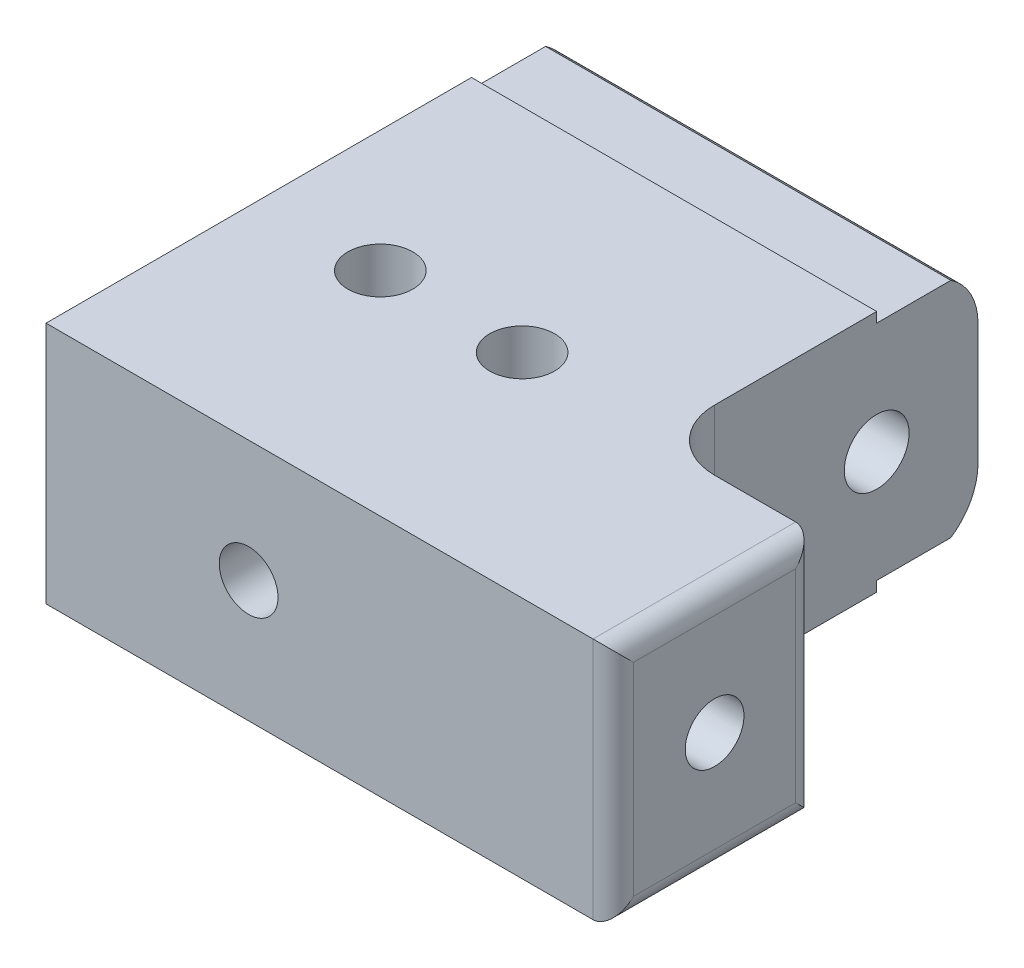
ISO-10303-21;
HEADER;
FILE_DESCRIPTION(('STEP AP214'),'2;1');
FILE_NAME('part.step','',(''),(''),'','','');
FILE_SCHEMA(('AUTOMOTIVE_DESIGN { 1 0 10303 214 1 1 1 1 }'));
ENDSEC;
DATA;
#1=APPLICATION_CONTEXT('core data for automotive mechanical design processes');
#2=APPLICATION_PROTOCOL_DEFINITION('international standard','automotive_design',2000,#1);
#3=PRODUCT_CONTEXT('',#1,'mechanical');
#4=PRODUCT('Part','Part','',(#3));
#5=PRODUCT_RELATED_PRODUCT_CATEGORY('part','',(#4));
#6=PRODUCT_DEFINITION_FORMATION('','',#4);
#7=PRODUCT_DEFINITION_CONTEXT('part definition',#1,'design');
#8=PRODUCT_DEFINITION('design','',#6,#7);
#9=PRODUCT_DEFINITION_SHAPE('','',#8);
#10=(LENGTH_UNIT() NAMED_UNIT(*) SI_UNIT(.MILLI.,.METRE.));
#11=(NAMED_UNIT(*) PLANE_ANGLE_UNIT() SI_UNIT($,.RADIAN.));
#12=(NAMED_UNIT(*) SI_UNIT($,.STERADIAN.) SOLID_ANGLE_UNIT());
#13=UNCERTAINTY_MEASURE_WITH_UNIT(LENGTH_MEASURE(1.E-05),#10,'distance_accuracy_value','');
#14=(GEOMETRIC_REPRESENTATION_CONTEXT(3) GLOBAL_UNCERTAINTY_ASSIGNED_CONTEXT((#13)) GLOBAL_UNIT_ASSIGNED_CONTEXT((#10,
#11,#12)) REPRESENTATION_CONTEXT('',''));
#15=CARTESIAN_POINT('',(0.,0.,0.));
#16=DIRECTION('',(0.,0.,1.));
#17=DIRECTION('',(1.,0.,0.));
#18=AXIS2_PLACEMENT_3D('',#15,#16,#17);
#19=CARTESIAN_POINT('',(28.,-6.,21.));
#20=DIRECTION('',(-1.,0.,0.));
#21=DIRECTION('',(0.,-1.,0.));
#22=AXIS2_PLACEMENT_3D('',#19,#20,#21);
#23=CYLINDRICAL_SURFACE('',#22,1.45);
#24=CARTESIAN_POINT('',(0.,-6.,21.));
#25=DIRECTION('',(-1.,0.,0.));
#26=DIRECTION('',(0.,-1.,0.));
#27=AXIS2_PLACEMENT_3D('',#24,#25,#26);
#28=CIRCLE('',#27,1.45);
#29=CARTESIAN_POINT('',(0.,-7.45,21.));
#30=VERTEX_POINT('',#29);
#31=EDGE_CURVE('E287',#30,#30,#28,.T.);
#32=ORIENTED_EDGE('',*,*,#31,.T.);
#33=EDGE_LOOP('',(#32));
#34=FACE_BOUND('',#33,.T.);
#35=CARTESIAN_POINT('',(10.,-6.,21.));
#36=DIRECTION('',(-0.707106781186547,0.,-0.707106781186547));
#37=DIRECTION('',(-0.707106781186547,0.,0.707106781186547));
#38=AXIS2_PLACEMENT_3D('',#35,#36,#37);
#39=ELLIPSE('',#38,2.05060966544099,1.45);
#40=CARTESIAN_POINT('',(10.,-4.55,21.));
#41=VERTEX_POINT('',#40);
#42=CARTESIAN_POINT('',(10.,-7.45,21.));
#43=VERTEX_POINT('',#42);
#44=EDGE_CURVE('E46',#41,#43,#39,.F.);
#45=ORIENTED_EDGE('',*,*,#44,.T.);
#46=CARTESIAN_POINT('',(10.,-6.,21.));
#47=DIRECTION('',(-0.707106781186547,0.,0.707106781186547));
#48=DIRECTION('',(-0.707106781186547,0.,-0.707106781186547));
#49=AXIS2_PLACEMENT_3D('',#46,#47,#48);
#50=ELLIPSE('',#49,2.05060966544099,1.45);
#51=EDGE_CURVE('E11',#43,#41,#50,.F.);
#52=ORIENTED_EDGE('',*,*,#51,.T.);
#53=EDGE_LOOP('',(#45,#52));
#54=FACE_BOUND('',#53,.T.);
#55=ADVANCED_FACE('F33',(#34,#54),#23,.F.);
#56=CARTESIAN_POINT('',(0.,0.,0.));
#57=DIRECTION('',(0.,0.,1.));
#58=DIRECTION('',(1.,0.,0.));
#59=AXIS2_PLACEMENT_3D('',#56,#57,#58);
#60=PLANE('',#59);
#61=DIRECTION('',(1.,0.,0.));
#62=VECTOR('',#61,1.);
#63=CARTESIAN_POINT('',(0.,-9.,0.));
#64=LINE('',#63,#62);
#65=CARTESIAN_POINT('',(20.,-9.,0.));
#66=VERTEX_POINT('',#65);
#67=CARTESIAN_POINT('',(12.75,-8.99999999999999,0.));
#68=VERTEX_POINT('',#67);
#69=EDGE_CURVE('E197',#66,#68,#64,.F.);
#70=ORIENTED_EDGE('',*,*,#69,.T.);
#71=DIRECTION('',(0.,-1.,0.));
#72=VECTOR('',#71,1.);
#73=CARTESIAN_POINT('',(12.75,7.37579522466093,0.));
#74=LINE('',#73,#72);
#75=CARTESIAN_POINT('',(12.75,-3.,0.));
#76=VERTEX_POINT('',#75);
#77=EDGE_CURVE('E343',#76,#68,#74,.T.);
#78=ORIENTED_EDGE('',*,*,#77,.F.);
#79=DIRECTION('',(-1.,0.,0.));
#80=VECTOR('',#79,1.);
#81=CARTESIAN_POINT('',(0.,-3.,0.));
#82=LINE('',#81,#80);
#83=CARTESIAN_POINT('',(20.,-3.,0.));
#84=VERTEX_POINT('',#83);
#85=EDGE_CURVE('E204',#76,#84,#82,.F.);
#86=ORIENTED_EDGE('',*,*,#85,.T.);
#87=DIRECTION('',(0.,1.,0.));
#88=VECTOR('',#87,1.);
#89=CARTESIAN_POINT('',(20.,0.,0.));
#90=LINE('',#89,#88);
#91=EDGE_CURVE('E263',#66,#84,#90,.T.);
#92=ORIENTED_EDGE('',*,*,#91,.F.);
#93=EDGE_LOOP('',(#70,#78,#86,#92));
#94=FACE_BOUND('',#93,.T.);
#95=ADVANCED_FACE('F368',(#94),#60,.F.);
#96=CARTESIAN_POINT('',(20.,0.,26.));
#97=DIRECTION('',(-1.,0.,0.));
#98=DIRECTION('',(0.,0.,1.));
#99=AXIS2_PLACEMENT_3D('',#96,#97,#98);
#100=PLANE('',#99);
#101=CARTESIAN_POINT('',(20.,-6.,5.));
#102=DIRECTION('',(-1.,0.,0.));
#103=DIRECTION('',(0.,0.,1.));
#104=AXIS2_PLACEMENT_3D('',#101,#102,#103);
#105=CIRCLE('',#104,1.6);
#106=CARTESIAN_POINT('',(20.,-6.,6.6));
#107=VERTEX_POINT('',#106);
#108=EDGE_CURVE('E280',#107,#107,#105,.T.);
#109=ORIENTED_EDGE('',*,*,#108,.T.);
#110=EDGE_LOOP('',(#109));
#111=FACE_BOUND('',#110,.T.);
#112=DIRECTION('',(0.,0.,1.));
#113=VECTOR('',#112,1.);
#114=CARTESIAN_POINT('',(20.,-0.499999999999995,26.));
#115=LINE('',#114,#113);
#116=CARTESIAN_POINT('',(20.,-0.500000000000001,1.3416876048223));
#117=VERTEX_POINT('',#116);
#118=CARTESIAN_POINT('',(20.,-0.499999999999998,5.));
#119=VERTEX_POINT('',#118);
#120=EDGE_CURVE('E320',#117,#119,#115,.T.);
#121=ORIENTED_EDGE('',*,*,#120,.T.);
#122=DIRECTION('',(0.,1.,0.));
#123=VECTOR('',#122,1.);
#124=CARTESIAN_POINT('',(20.,0.,5.));
#125=LINE('',#124,#123);
#126=CARTESIAN_POINT('',(20.,0.,5.));
#127=VERTEX_POINT('',#126);
#128=EDGE_CURVE('E317',#119,#127,#125,.T.);
#129=ORIENTED_EDGE('',*,*,#128,.T.);
#130=DIRECTION('',(0.,0.,-1.));
#131=VECTOR('',#130,1.);
#132=CARTESIAN_POINT('',(20.,0.,26.));
#133=LINE('',#132,#131);
#134=CARTESIAN_POINT('',(20.,0.,13.));
#135=VERTEX_POINT('',#134);
#136=EDGE_CURVE('E256',#135,#127,#133,.T.);
#137=ORIENTED_EDGE('',*,*,#136,.F.);
#138=DIRECTION('',(0.,1.,0.));
#139=VECTOR('',#138,1.);
#140=CARTESIAN_POINT('',(20.,-12.,13.));
#141=LINE('',#140,#139);
#142=CARTESIAN_POINT('',(20.,-12.,13.));
#143=VERTEX_POINT('',#142);
#144=EDGE_CURVE('E245',#135,#143,#141,.F.);
#145=ORIENTED_EDGE('',*,*,#144,.T.);
#146=DIRECTION('',(0.,0.,-1.));
#147=VECTOR('',#146,1.);
#148=CARTESIAN_POINT('',(20.,-12.,26.));
#149=LINE('',#148,#147);
#150=CARTESIAN_POINT('',(20.,-12.,5.));
#151=VERTEX_POINT('',#150);
#152=EDGE_CURVE('E253',#143,#151,#149,.T.);
#153=ORIENTED_EDGE('',*,*,#152,.T.);
#154=DIRECTION('',(0.,1.,0.));
#155=VECTOR('',#154,1.);
#156=CARTESIAN_POINT('',(20.,0.,4.99999999999998));
#157=LINE('',#156,#155);
#158=CARTESIAN_POINT('',(20.,-11.5,5.));
#159=VERTEX_POINT('',#158);
#160=EDGE_CURVE('E222',#151,#159,#157,.T.);
#161=ORIENTED_EDGE('',*,*,#160,.T.);
#162=DIRECTION('',(0.,0.,-1.));
#163=VECTOR('',#162,1.);
#164=CARTESIAN_POINT('',(20.,-11.5,26.));
#165=LINE('',#164,#163);
#166=CARTESIAN_POINT('',(20.,-11.5,1.3416876048223));
#167=VERTEX_POINT('',#166);
#168=EDGE_CURVE('E305',#159,#167,#165,.T.);
#169=ORIENTED_EDGE('',*,*,#168,.T.);
#170=CARTESIAN_POINT('',(20.,-9.,3.));
#171=DIRECTION('',(-1.,0.,0.));
#172=DIRECTION('',(0.,0.,1.));
#173=AXIS2_PLACEMENT_3D('',#170,#171,#172);
#174=CIRCLE('',#173,3.);
#175=EDGE_CURVE('E205',#167,#66,#174,.F.);
#176=ORIENTED_EDGE('',*,*,#175,.T.);
#177=ORIENTED_EDGE('',*,*,#91,.T.);
#178=CARTESIAN_POINT('',(20.,-3.,3.));
#179=DIRECTION('',(-1.,0.,0.));
#180=DIRECTION('',(0.,0.,1.));
#181=AXIS2_PLACEMENT_3D('',#178,#179,#180);
#182=CIRCLE('',#181,3.);
#183=EDGE_CURVE('E207',#84,#117,#182,.F.);
#184=ORIENTED_EDGE('',*,*,#183,.T.);
#185=EDGE_LOOP('',(#121,#129,#137,#145,#153,#161,#169,#176,#177,#184));
#186=FACE_BOUND('',#185,.T.);
#187=ADVANCED_FACE('F374',(#111,#186),#100,.F.);
#188=CARTESIAN_POINT('',(0.,0.,26.));
#189=DIRECTION('',(1.,0.,0.));
#190=DIRECTION('',(0.,1.,0.));
#191=AXIS2_PLACEMENT_3D('',#188,#189,#190);
#192=PLANE('',#191);
#193=ORIENTED_EDGE('',*,*,#31,.F.);
#194=EDGE_LOOP('',(#193));
#195=FACE_BOUND('',#194,.T.);
#196=CARTESIAN_POINT('',(0.,-6.,5.));
#197=DIRECTION('',(-1.,0.,0.));
#198=DIRECTION('',(0.,-1.,0.));
#199=AXIS2_PLACEMENT_3D('',#196,#197,#198);
#200=CIRCLE('',#199,1.6);
#201=CARTESIAN_POINT('',(0.,-7.6,5.));
#202=VERTEX_POINT('',#201);
#203=EDGE_CURVE('E283',#202,#202,#200,.T.);
#204=ORIENTED_EDGE('',*,*,#203,.F.);
#205=EDGE_LOOP('',(#204));
#206=FACE_BOUND('',#205,.T.);
#207=DIRECTION('',(0.,0.,-1.));
#208=VECTOR('',#207,1.);
#209=CARTESIAN_POINT('',(0.,0.,26.));
#210=LINE('',#209,#208);
#211=CARTESIAN_POINT('',(0.,0.,26.));
#212=VERTEX_POINT('',#211);
#213=CARTESIAN_POINT('',(0.,0.,5.));
#214=VERTEX_POINT('',#213);
#215=EDGE_CURVE('E259',#212,#214,#210,.T.);
#216=ORIENTED_EDGE('',*,*,#215,.T.);
#217=DIRECTION('',(0.,1.,0.));
#218=VECTOR('',#217,1.);
#219=CARTESIAN_POINT('',(0.,0.,5.));
#220=LINE('',#219,#218);
#221=CARTESIAN_POINT('',(0.,-0.5,5.));
#222=VERTEX_POINT('',#221);
#223=EDGE_CURVE('E331',#222,#214,#220,.T.);
#224=ORIENTED_EDGE('',*,*,#223,.F.);
#225=DIRECTION('',(0.,0.,1.));
#226=VECTOR('',#225,1.);
#227=CARTESIAN_POINT('',(0.,-0.5,5.));
#228=LINE('',#227,#226);
#229=CARTESIAN_POINT('',(0.,-0.500000000000001,1.3416876048223));
#230=VERTEX_POINT('',#229);
#231=EDGE_CURVE('E327',#230,#222,#228,.T.);
#232=ORIENTED_EDGE('',*,*,#231,.F.);
#233=CARTESIAN_POINT('',(0.,-3.,3.));
#234=DIRECTION('',(1.,0.,0.));
#235=DIRECTION('',(0.,1.,0.));
#236=AXIS2_PLACEMENT_3D('',#233,#234,#235);
#237=CIRCLE('',#236,3.);
#238=CARTESIAN_POINT('',(0.,-3.,0.));
#239=VERTEX_POINT('',#238);
#240=EDGE_CURVE('E195',#230,#239,#237,.F.);
#241=ORIENTED_EDGE('',*,*,#240,.T.);
#242=DIRECTION('',(0.,-1.,0.));
#243=VECTOR('',#242,1.);
#244=CARTESIAN_POINT('',(0.,0.,0.));
#245=LINE('',#244,#243);
#246=CARTESIAN_POINT('',(0.,-9.,0.));
#247=VERTEX_POINT('',#246);
#248=EDGE_CURVE('E267',#239,#247,#245,.T.);
#249=ORIENTED_EDGE('',*,*,#248,.T.);
#250=CARTESIAN_POINT('',(0.,-9.,3.));
#251=DIRECTION('',(1.,0.,0.));
#252=DIRECTION('',(0.,1.,0.));
#253=AXIS2_PLACEMENT_3D('',#250,#251,#252);
#254=CIRCLE('',#253,3.);
#255=CARTESIAN_POINT('',(0.,-11.5,1.3416876048223));
#256=VERTEX_POINT('',#255);
#257=EDGE_CURVE('E192',#247,#256,#254,.F.);
#258=ORIENTED_EDGE('',*,*,#257,.T.);
#259=DIRECTION('',(0.,0.,-1.));
#260=VECTOR('',#259,1.);
#261=CARTESIAN_POINT('',(0.,-11.5,5.));
#262=LINE('',#261,#260);
#263=CARTESIAN_POINT('',(0.,-11.5,5.));
#264=VERTEX_POINT('',#263);
#265=EDGE_CURVE('E311',#264,#256,#262,.T.);
#266=ORIENTED_EDGE('',*,*,#265,.F.);
#267=DIRECTION('',(0.,1.,0.));
#268=VECTOR('',#267,1.);
#269=CARTESIAN_POINT('',(0.,-12.,5.));
#270=LINE('',#269,#268);
#271=CARTESIAN_POINT('',(0.,-12.,5.));
#272=VERTEX_POINT('',#271);
#273=EDGE_CURVE('E314',#272,#264,#270,.T.);
#274=ORIENTED_EDGE('',*,*,#273,.F.);
#275=DIRECTION('',(0.,0.,-1.));
#276=VECTOR('',#275,1.);
#277=CARTESIAN_POINT('',(0.,-12.,26.));
#278=LINE('',#277,#276);
#279=CARTESIAN_POINT('',(0.,-12.,26.));
#280=VERTEX_POINT('',#279);
#281=EDGE_CURVE('E250',#280,#272,#278,.T.);
#282=ORIENTED_EDGE('',*,*,#281,.F.);
#283=DIRECTION('',(0.,-1.,0.));
#284=VECTOR('',#283,1.);
#285=CARTESIAN_POINT('',(0.,0.,26.));
#286=LINE('',#285,#284);
#287=EDGE_CURVE('E266',#212,#280,#286,.T.);
#288=ORIENTED_EDGE('',*,*,#287,.F.);
#289=EDGE_LOOP('',(#216,#224,#232,#241,#249,#258,#266,#274,#282,#288));
#290=FACE_BOUND('',#289,.T.);
#291=ADVANCED_FACE('F415',(#195,#206,#290),#192,.F.);
#292=CARTESIAN_POINT('',(0.,-12.,26.));
#293=DIRECTION('',(0.,1.,0.));
#294=DIRECTION('',(0.,0.,1.));
#295=AXIS2_PLACEMENT_3D('',#292,#293,#294);
#296=PLANE('',#295);
#297=CARTESIAN_POINT('',(6.,-12.,15.5));
#298=DIRECTION('',(0.,1.,0.));
#299=DIRECTION('',(0.,0.,1.));
#300=AXIS2_PLACEMENT_3D('',#297,#298,#299);
#301=CIRCLE('',#300,1.6);
#302=CARTESIAN_POINT('',(6.,-12.,17.1));
#303=VERTEX_POINT('',#302);
#304=EDGE_CURVE('E296',#303,#303,#301,.T.);
#305=ORIENTED_EDGE('',*,*,#304,.T.);
#306=EDGE_LOOP('',(#305));
#307=FACE_BOUND('',#306,.T.);
#308=CARTESIAN_POINT('',(13.,-12.,15.5));
#309=DIRECTION('',(0.,1.,0.));
#310=DIRECTION('',(0.,0.,1.));
#311=AXIS2_PLACEMENT_3D('',#308,#309,#310);
#312=CIRCLE('',#311,1.6);
#313=CARTESIAN_POINT('',(13.,-12.,17.1));
#314=VERTEX_POINT('',#313);
#315=EDGE_CURVE('E290',#314,#314,#312,.T.);
#316=ORIENTED_EDGE('',*,*,#315,.T.);
#317=EDGE_LOOP('',(#316));
#318=FACE_BOUND('',#317,.T.);
#319=ORIENTED_EDGE('',*,*,#281,.T.);
#320=DIRECTION('',(-1.,0.,0.));
#321=VECTOR('',#320,1.);
#322=CARTESIAN_POINT('',(28.,-12.,5.));
#323=LINE('',#322,#321);
#324=EDGE_CURVE('E308',#151,#272,#323,.T.);
#325=ORIENTED_EDGE('',*,*,#324,.F.);
#326=ORIENTED_EDGE('',*,*,#152,.F.);
#327=CARTESIAN_POINT('',(23.,-12.,13.));
#328=DIRECTION('',(0.,1.,0.));
#329=DIRECTION('',(0.,0.,1.));
#330=AXIS2_PLACEMENT_3D('',#327,#328,#329);
#331=CIRCLE('',#330,3.);
#332=CARTESIAN_POINT('',(23.,-12.,16.));
#333=VERTEX_POINT('',#332);
#334=EDGE_CURVE('E240',#143,#333,#331,.T.);
#335=ORIENTED_EDGE('',*,*,#334,.T.);
#336=DIRECTION('',(-1.,0.,0.));
#337=VECTOR('',#336,1.);
#338=CARTESIAN_POINT('',(28.,-12.,16.));
#339=LINE('',#338,#337);
#340=CARTESIAN_POINT('',(27.,-12.,16.));
#341=VERTEX_POINT('',#340);
#342=EDGE_CURVE('E270',#341,#333,#339,.T.);
#343=ORIENTED_EDGE('',*,*,#342,.F.);
#344=DIRECTION('',(0.,0.,-1.));
#345=VECTOR('',#344,1.);
#346=CARTESIAN_POINT('',(27.,-12.,26.));
#347=LINE('',#346,#345);
#348=CARTESIAN_POINT('',(27.,-12.,26.));
#349=VERTEX_POINT('',#348);
#350=EDGE_CURVE('E224',#341,#349,#347,.F.);
#351=ORIENTED_EDGE('',*,*,#350,.T.);
#352=DIRECTION('',(1.,0.,0.));
#353=VECTOR('',#352,1.);
#354=CARTESIAN_POINT('',(0.,-12.,26.));
#355=LINE('',#354,#353);
#356=EDGE_CURVE('E272',#280,#349,#355,.T.);
#357=ORIENTED_EDGE('',*,*,#356,.F.);
#358=EDGE_LOOP('',(#319,#325,#326,#335,#343,#351,#357));
#359=FACE_BOUND('',#358,.T.);
#360=ADVANCED_FACE('F411',(#307,#318,#359),#296,.F.);
#361=CARTESIAN_POINT('',(0.,0.,26.));
#362=DIRECTION('',(0.,-1.,0.));
#363=DIRECTION('',(0.,0.,-1.));
#364=AXIS2_PLACEMENT_3D('',#361,#362,#363);
#365=PLANE('',#364);
#366=CARTESIAN_POINT('',(6.,0.,15.5));
#367=DIRECTION('',(0.,1.,0.));
#368=DIRECTION('',(0.,0.,1.));
#369=AXIS2_PLACEMENT_3D('',#366,#367,#368);
#370=CIRCLE('',#369,1.6);
#371=CARTESIAN_POINT('',(6.,0.,17.1));
#372=VERTEX_POINT('',#371);
#373=EDGE_CURVE('E214',#372,#372,#370,.T.);
#374=ORIENTED_EDGE('',*,*,#373,.F.);
#375=EDGE_LOOP('',(#374));
#376=FACE_BOUND('',#375,.T.);
#377=CARTESIAN_POINT('',(13.,0.,15.5));
#378=DIRECTION('',(0.,1.,0.));
#379=DIRECTION('',(0.,0.,1.));
#380=AXIS2_PLACEMENT_3D('',#377,#378,#379);
#381=CIRCLE('',#380,1.6);
#382=CARTESIAN_POINT('',(13.,0.,17.1));
#383=VERTEX_POINT('',#382);
#384=EDGE_CURVE('E293',#383,#383,#381,.T.);
#385=ORIENTED_EDGE('',*,*,#384,.F.);
#386=EDGE_LOOP('',(#385));
#387=FACE_BOUND('',#386,.T.);
#388=ORIENTED_EDGE('',*,*,#136,.T.);
#389=DIRECTION('',(-1.,0.,0.));
#390=VECTOR('',#389,1.);
#391=CARTESIAN_POINT('',(28.,0.,5.));
#392=LINE('',#391,#390);
#393=EDGE_CURVE('E324',#127,#214,#392,.T.);
#394=ORIENTED_EDGE('',*,*,#393,.T.);
#395=ORIENTED_EDGE('',*,*,#215,.F.);
#396=DIRECTION('',(-1.,0.,0.));
#397=VECTOR('',#396,1.);
#398=CARTESIAN_POINT('',(0.,0.,26.));
#399=LINE('',#398,#397);
#400=CARTESIAN_POINT('',(27.,0.,26.));
#401=VERTEX_POINT('',#400);
#402=EDGE_CURVE('E262',#401,#212,#399,.T.);
#403=ORIENTED_EDGE('',*,*,#402,.F.);
#404=DIRECTION('',(0.,0.,1.));
#405=VECTOR('',#404,1.);
#406=CARTESIAN_POINT('',(27.,0.,26.));
#407=LINE('',#406,#405);
#408=CARTESIAN_POINT('',(27.,0.,16.));
#409=VERTEX_POINT('',#408);
#410=EDGE_CURVE('E228',#401,#409,#407,.F.);
#411=ORIENTED_EDGE('',*,*,#410,.T.);
#412=DIRECTION('',(-1.,0.,0.));
#413=VECTOR('',#412,1.);
#414=CARTESIAN_POINT('',(28.,0.,16.));
#415=LINE('',#414,#413);
#416=CARTESIAN_POINT('',(23.,0.,16.));
#417=VERTEX_POINT('',#416);
#418=EDGE_CURVE('E278',#409,#417,#415,.T.);
#419=ORIENTED_EDGE('',*,*,#418,.T.);
#420=CARTESIAN_POINT('',(23.,0.,13.));
#421=DIRECTION('',(0.,-1.,0.));
#422=DIRECTION('',(0.,0.,-1.));
#423=AXIS2_PLACEMENT_3D('',#420,#421,#422);
#424=CIRCLE('',#423,3.);
#425=EDGE_CURVE('E243',#417,#135,#424,.T.);
#426=ORIENTED_EDGE('',*,*,#425,.T.);
#427=EDGE_LOOP('',(#388,#394,#395,#403,#411,#419,#426));
#428=FACE_BOUND('',#427,.T.);
#429=ADVANCED_FACE('F404',(#376,#387,#428),#365,.F.);
#430=CARTESIAN_POINT('',(0.,0.,26.));
#431=DIRECTION('',(0.,0.,1.));
#432=DIRECTION('',(1.,0.,0.));
#433=AXIS2_PLACEMENT_3D('',#430,#431,#432);
#434=PLANE('',#433);
#435=CARTESIAN_POINT('',(10.,-6.,26.));
#436=DIRECTION('',(0.,0.,1.));
#437=DIRECTION('',(1.,0.,0.));
#438=AXIS2_PLACEMENT_3D('',#435,#436,#437);
#439=CIRCLE('',#438,1.45);
#440=CARTESIAN_POINT('',(11.45,-6.,26.));
#441=VERTEX_POINT('',#440);
#442=EDGE_CURVE('E349',#441,#441,#439,.T.);
#443=ORIENTED_EDGE('',*,*,#442,.F.);
#444=EDGE_LOOP('',(#443));
#445=FACE_BOUND('',#444,.T.);
#446=ORIENTED_EDGE('',*,*,#356,.T.);
#447=DIRECTION('',(0.,-1.,0.));
#448=VECTOR('',#447,1.);
#449=CARTESIAN_POINT('',(27.,0.,26.));
#450=LINE('',#449,#448);
#451=EDGE_CURVE('E210',#349,#401,#450,.F.);
#452=ORIENTED_EDGE('',*,*,#451,.T.);
#453=ORIENTED_EDGE('',*,*,#402,.T.);
#454=ORIENTED_EDGE('',*,*,#287,.T.);
#455=EDGE_LOOP('',(#446,#452,#453,#454));
#456=FACE_BOUND('',#455,.T.);
#457=ADVANCED_FACE('F402',(#445,#456),#434,.T.);
#458=CARTESIAN_POINT('',(7.25,-3.,0.));
#459=VERTEX_POINT('',#458);
#460=EDGE_CURVE('E201',#239,#459,#82,.F.);
#461=ORIENTED_EDGE('',*,*,#460,.T.);
#462=DIRECTION('',(0.,1.,0.));
#463=VECTOR('',#462,1.);
#464=CARTESIAN_POINT('',(7.25,7.37579522466093,0.));
#465=LINE('',#464,#463);
#466=CARTESIAN_POINT('',(7.25,-9.,0.));
#467=VERTEX_POINT('',#466);
#468=EDGE_CURVE('E340',#467,#459,#465,.T.);
#469=ORIENTED_EDGE('',*,*,#468,.F.);
#470=EDGE_CURVE('E200',#467,#247,#64,.F.);
#471=ORIENTED_EDGE('',*,*,#470,.T.);
#472=ORIENTED_EDGE('',*,*,#248,.F.);
#473=EDGE_LOOP('',(#461,#469,#471,#472));
#474=FACE_BOUND('',#473,.T.);
#475=ADVANCED_FACE('F377',(#474),#60,.F.);
#476=CARTESIAN_POINT('',(28.,-12.,16.));
#477=DIRECTION('',(0.,0.,1.));
#478=DIRECTION('',(1.,0.,0.));
#479=AXIS2_PLACEMENT_3D('',#476,#477,#478);
#480=PLANE('',#479);
#481=ORIENTED_EDGE('',*,*,#418,.F.);
#482=DIRECTION('',(0.,1.,0.));
#483=VECTOR('',#482,1.);
#484=CARTESIAN_POINT('',(27.,-12.,16.));
#485=LINE('',#484,#483);
#486=EDGE_CURVE('E226',#409,#341,#485,.F.);
#487=ORIENTED_EDGE('',*,*,#486,.T.);
#488=ORIENTED_EDGE('',*,*,#342,.T.);
#489=DIRECTION('',(0.,1.,0.));
#490=VECTOR('',#489,1.);
#491=CARTESIAN_POINT('',(23.,0.,16.));
#492=LINE('',#491,#490);
#493=EDGE_CURVE('E247',#333,#417,#492,.T.);
#494=ORIENTED_EDGE('',*,*,#493,.T.);
#495=EDGE_LOOP('',(#481,#487,#488,#494));
#496=FACE_BOUND('',#495,.T.);
#497=ADVANCED_FACE('F394',(#496),#480,.F.);
#498=CARTESIAN_POINT('',(28.,0.,0.));
#499=DIRECTION('',(-1.,0.,0.));
#500=DIRECTION('',(0.,0.,1.));
#501=AXIS2_PLACEMENT_3D('',#498,#499,#500);
#502=PLANE('',#501);
#503=DIRECTION('',(0.,1.,0.));
#504=VECTOR('',#503,1.);
#505=CARTESIAN_POINT('',(28.,0.,17.));
#506=LINE('',#505,#504);
#507=CARTESIAN_POINT('',(28.,-11.,17.));
#508=VERTEX_POINT('',#507);
#509=CARTESIAN_POINT('',(28.,-1.,17.));
#510=VERTEX_POINT('',#509);
#511=EDGE_CURVE('E234',#508,#510,#506,.T.);
#512=ORIENTED_EDGE('',*,*,#511,.T.);
#513=DIRECTION('',(0.,0.,1.));
#514=VECTOR('',#513,1.);
#515=CARTESIAN_POINT('',(28.,-1.,0.));
#516=LINE('',#515,#514);
#517=CARTESIAN_POINT('',(28.,-1.,25.));
#518=VERTEX_POINT('',#517);
#519=EDGE_CURVE('E231',#510,#518,#516,.T.);
#520=ORIENTED_EDGE('',*,*,#519,.T.);
#521=DIRECTION('',(0.,-1.,0.));
#522=VECTOR('',#521,1.);
#523=CARTESIAN_POINT('',(28.,-12.,25.));
#524=LINE('',#523,#522);
#525=CARTESIAN_POINT('',(28.,-11.,25.));
#526=VERTEX_POINT('',#525);
#527=EDGE_CURVE('E238',#518,#526,#524,.T.);
#528=ORIENTED_EDGE('',*,*,#527,.T.);
#529=DIRECTION('',(0.,0.,-1.));
#530=VECTOR('',#529,1.);
#531=CARTESIAN_POINT('',(28.,-11.,0.));
#532=LINE('',#531,#530);
#533=EDGE_CURVE('E236',#526,#508,#532,.T.);
#534=ORIENTED_EDGE('',*,*,#533,.T.);
#535=EDGE_LOOP('',(#512,#520,#528,#534));
#536=FACE_BOUND('',#535,.T.);
#537=CARTESIAN_POINT('',(28.,-6.,21.));
#538=DIRECTION('',(-1.,0.,0.));
#539=DIRECTION('',(0.,-1.,0.));
#540=AXIS2_PLACEMENT_3D('',#537,#538,#539);
#541=CIRCLE('',#540,1.45);
#542=CARTESIAN_POINT('',(28.,-7.45,21.));
#543=VERTEX_POINT('',#542);
#544=EDGE_CURVE('E286',#543,#543,#541,.T.);
#545=ORIENTED_EDGE('',*,*,#544,.T.);
#546=EDGE_LOOP('',(#545));
#547=FACE_BOUND('',#546,.T.);
#548=ADVANCED_FACE('F389',(#536,#547),#502,.F.);
#549=CARTESIAN_POINT('',(28.,-6.,5.));
#550=DIRECTION('',(-1.,0.,0.));
#551=DIRECTION('',(0.,-1.,0.));
#552=AXIS2_PLACEMENT_3D('',#549,#550,#551);
#553=CYLINDRICAL_SURFACE('',#552,1.6);
#554=ORIENTED_EDGE('',*,*,#203,.T.);
#555=EDGE_LOOP('',(#554));
#556=FACE_BOUND('',#555,.T.);
#557=ORIENTED_EDGE('',*,*,#108,.F.);
#558=EDGE_LOOP('',(#557));
#559=FACE_BOUND('',#558,.T.);
#560=ADVANCED_FACE('F382',(#556,#559),#553,.F.);
#561=CARTESIAN_POINT('',(10.,-6.,21.));
#562=DIRECTION('',(-0.707106781186547,0.,-0.707106781186547));
#563=DIRECTION('',(-0.707106781186547,0.,0.707106781186547));
#564=AXIS2_PLACEMENT_3D('',#561,#562,#563);
#565=ELLIPSE('',#564,2.05060966544099,1.45);
#566=EDGE_CURVE('E170',#41,#43,#565,.T.);
#567=ORIENTED_EDGE('',*,*,#566,.T.);
#568=CARTESIAN_POINT('',(10.,-6.,21.));
#569=DIRECTION('',(-0.707106781186547,0.,0.707106781186547));
#570=DIRECTION('',(-0.707106781186547,0.,-0.707106781186547));
#571=AXIS2_PLACEMENT_3D('',#568,#569,#570);
#572=ELLIPSE('',#571,2.05060966544099,1.45);
#573=EDGE_CURVE('E41',#43,#41,#572,.T.);
#574=ORIENTED_EDGE('',*,*,#573,.T.);
#575=EDGE_LOOP('',(#567,#574));
#576=FACE_BOUND('',#575,.T.);
#577=ORIENTED_EDGE('',*,*,#544,.F.);
#578=EDGE_LOOP('',(#577));
#579=FACE_BOUND('',#578,.T.);
#580=ADVANCED_FACE('F179',(#576,#579),#23,.F.);
#581=CARTESIAN_POINT('',(13.,-12.,15.5));
#582=DIRECTION('',(0.,1.,0.));
#583=DIRECTION('',(0.,0.,1.));
#584=AXIS2_PLACEMENT_3D('',#581,#582,#583);
#585=CYLINDRICAL_SURFACE('',#584,1.6);
#586=ORIENTED_EDGE('',*,*,#315,.F.);
#587=EDGE_LOOP('',(#586));
#588=FACE_BOUND('',#587,.T.);
#589=ORIENTED_EDGE('',*,*,#384,.T.);
#590=EDGE_LOOP('',(#589));
#591=FACE_BOUND('',#590,.T.);
#592=ADVANCED_FACE('F381',(#588,#591),#585,.F.);
#593=CARTESIAN_POINT('',(6.,-12.,15.5));
#594=DIRECTION('',(0.,1.,0.));
#595=DIRECTION('',(0.,0.,1.));
#596=AXIS2_PLACEMENT_3D('',#593,#594,#595);
#597=CYLINDRICAL_SURFACE('',#596,1.6);
#598=ORIENTED_EDGE('',*,*,#304,.F.);
#599=EDGE_LOOP('',(#598));
#600=FACE_BOUND('',#599,.T.);
#601=ORIENTED_EDGE('',*,*,#373,.T.);
#602=EDGE_LOOP('',(#601));
#603=FACE_BOUND('',#602,.T.);
#604=ADVANCED_FACE('F387',(#600,#603),#597,.F.);
#605=CARTESIAN_POINT('',(23.,-12.,13.));
#606=DIRECTION('',(0.,-1.,0.));
#607=DIRECTION('',(0.,0.,-1.));
#608=AXIS2_PLACEMENT_3D('',#605,#606,#607);
#609=CYLINDRICAL_SURFACE('',#608,3.);
#610=ORIENTED_EDGE('',*,*,#334,.F.);
#611=ORIENTED_EDGE('',*,*,#144,.F.);
#612=ORIENTED_EDGE('',*,*,#425,.F.);
#613=ORIENTED_EDGE('',*,*,#493,.F.);
#614=EDGE_LOOP('',(#610,#611,#612,#613));
#615=FACE_BOUND('',#614,.T.);
#616=ADVANCED_FACE('F423',(#615),#609,.F.);
#617=CARTESIAN_POINT('',(27.,-11.,0.));
#618=DIRECTION('',(0.,0.,-1.));
#619=DIRECTION('',(-1.,0.,0.));
#620=AXIS2_PLACEMENT_3D('',#617,#618,#619);
#621=CYLINDRICAL_SURFACE('',#620,1.);
#622=CARTESIAN_POINT('',(27.,-11.,25.));
#623=DIRECTION('',(0.,0.707106781186547,0.707106781186547));
#624=DIRECTION('',(0.,0.707106781186547,-0.707106781186547));
#625=AXIS2_PLACEMENT_3D('',#622,#623,#624);
#626=ELLIPSE('',#625,1.41421356237309,1.);
#627=EDGE_CURVE('E215',#349,#526,#626,.T.);
#628=ORIENTED_EDGE('',*,*,#627,.F.);
#629=ORIENTED_EDGE('',*,*,#350,.F.);
#630=CARTESIAN_POINT('',(27.,-11.,17.));
#631=DIRECTION('',(0.,0.707106781186547,-0.707106781186547));
#632=DIRECTION('',(0.,-0.707106781186547,-0.707106781186547));
#633=AXIS2_PLACEMENT_3D('',#630,#631,#632);
#634=ELLIPSE('',#633,1.41421356237309,1.);
#635=EDGE_CURVE('E211',#508,#341,#634,.T.);
#636=ORIENTED_EDGE('',*,*,#635,.F.);
#637=ORIENTED_EDGE('',*,*,#533,.F.);
#638=EDGE_LOOP('',(#628,#629,#636,#637));
#639=FACE_BOUND('',#638,.T.);
#640=ADVANCED_FACE('F426',(#639),#621,.T.);
#641=CARTESIAN_POINT('',(27.,0.,17.));
#642=DIRECTION('',(0.,1.,0.));
#643=DIRECTION('',(0.,0.,1.));
#644=AXIS2_PLACEMENT_3D('',#641,#642,#643);
#645=CYLINDRICAL_SURFACE('',#644,1.);
#646=ORIENTED_EDGE('',*,*,#635,.T.);
#647=ORIENTED_EDGE('',*,*,#486,.F.);
#648=CARTESIAN_POINT('',(27.,-1.,17.));
#649=DIRECTION('',(0.,0.707106781186547,0.707106781186547));
#650=DIRECTION('',(0.,0.707106781186547,-0.707106781186547));
#651=AXIS2_PLACEMENT_3D('',#648,#649,#650);
#652=ELLIPSE('',#651,1.41421356237309,1.);
#653=EDGE_CURVE('E218',#510,#409,#652,.T.);
#654=ORIENTED_EDGE('',*,*,#653,.F.);
#655=ORIENTED_EDGE('',*,*,#511,.F.);
#656=EDGE_LOOP('',(#646,#647,#654,#655));
#657=FACE_BOUND('',#656,.T.);
#658=ADVANCED_FACE('F436',(#657),#645,.T.);
#659=CARTESIAN_POINT('',(27.,0.,25.));
#660=DIRECTION('',(0.,1.,0.));
#661=DIRECTION('',(0.,0.,1.));
#662=AXIS2_PLACEMENT_3D('',#659,#660,#661);
#663=CYLINDRICAL_SURFACE('',#662,1.);
#664=ORIENTED_EDGE('',*,*,#627,.T.);
#665=ORIENTED_EDGE('',*,*,#527,.F.);
#666=CARTESIAN_POINT('',(27.,-1.,25.));
#667=DIRECTION('',(0.,0.707106781186547,-0.707106781186547));
#668=DIRECTION('',(0.,0.707106781186547,0.707106781186547));
#669=AXIS2_PLACEMENT_3D('',#666,#667,#668);
#670=ELLIPSE('',#669,1.41421356237309,1.);
#671=EDGE_CURVE('E220',#401,#518,#670,.T.);
#672=ORIENTED_EDGE('',*,*,#671,.F.);
#673=ORIENTED_EDGE('',*,*,#451,.F.);
#674=EDGE_LOOP('',(#664,#665,#672,#673));
#675=FACE_BOUND('',#674,.T.);
#676=ADVANCED_FACE('F432',(#675),#663,.T.);
#677=CARTESIAN_POINT('',(27.,-1.,0.));
#678=DIRECTION('',(0.,0.,1.));
#679=DIRECTION('',(1.,0.,0.));
#680=AXIS2_PLACEMENT_3D('',#677,#678,#679);
#681=CYLINDRICAL_SURFACE('',#680,1.);
#682=ORIENTED_EDGE('',*,*,#653,.T.);
#683=ORIENTED_EDGE('',*,*,#410,.F.);
#684=ORIENTED_EDGE('',*,*,#671,.T.);
#685=ORIENTED_EDGE('',*,*,#519,.F.);
#686=EDGE_LOOP('',(#682,#683,#684,#685));
#687=FACE_BOUND('',#686,.T.);
#688=ADVANCED_FACE('F428',(#687),#681,.T.);
#689=CARTESIAN_POINT('',(0.,-9.,3.));
#690=DIRECTION('',(1.,0.,0.));
#691=DIRECTION('',(0.,0.,-1.));
#692=AXIS2_PLACEMENT_3D('',#689,#690,#691);
#693=CYLINDRICAL_SURFACE('',#692,3.);
#694=CARTESIAN_POINT('',(12.75,-9.,3.));
#695=DIRECTION('',(1.,0.,0.));
#696=DIRECTION('',(0.,1.,0.));
#697=AXIS2_PLACEMENT_3D('',#694,#695,#696);
#698=CIRCLE('',#697,3.);
#699=CARTESIAN_POINT('',(12.75,-11.0396078054371,0.8));
#700=VERTEX_POINT('',#699);
#701=EDGE_CURVE('E333',#68,#700,#698,.F.);
#702=ORIENTED_EDGE('',*,*,#701,.F.);
#703=ORIENTED_EDGE('',*,*,#69,.F.);
#704=ORIENTED_EDGE('',*,*,#175,.F.);
#705=DIRECTION('',(1.,0.,0.));
#706=VECTOR('',#705,1.);
#707=CARTESIAN_POINT('',(0.,-11.5,1.3416876048223));
#708=LINE('',#707,#706);
#709=EDGE_CURVE('E190',#256,#167,#708,.T.);
#710=ORIENTED_EDGE('',*,*,#709,.F.);
#711=ORIENTED_EDGE('',*,*,#257,.F.);
#712=ORIENTED_EDGE('',*,*,#470,.F.);
#713=CARTESIAN_POINT('',(7.25,-9.,3.));
#714=DIRECTION('',(-1.,0.,0.));
#715=DIRECTION('',(0.,-1.,0.));
#716=AXIS2_PLACEMENT_3D('',#713,#714,#715);
#717=CIRCLE('',#716,3.);
#718=CARTESIAN_POINT('',(7.25,-11.0396078054371,0.8));
#719=VERTEX_POINT('',#718);
#720=EDGE_CURVE('E335',#719,#467,#717,.F.);
#721=ORIENTED_EDGE('',*,*,#720,.F.);
#722=DIRECTION('',(1.,0.,0.));
#723=VECTOR('',#722,1.);
#724=CARTESIAN_POINT('',(0.,-11.0396078054371,0.8));
#725=LINE('',#724,#723);
#726=EDGE_CURVE('E337',#719,#700,#725,.T.);
#727=ORIENTED_EDGE('',*,*,#726,.T.);
#728=EDGE_LOOP('',(#702,#703,#704,#710,#711,#712,#721,#727));
#729=FACE_BOUND('',#728,.T.);
#730=ADVANCED_FACE('F431',(#729),#693,.T.);
#731=CARTESIAN_POINT('',(0.,-3.,3.));
#732=DIRECTION('',(-1.,0.,0.));
#733=DIRECTION('',(0.,0.,1.));
#734=AXIS2_PLACEMENT_3D('',#731,#732,#733);
#735=CYLINDRICAL_SURFACE('',#734,3.);
#736=CARTESIAN_POINT('',(12.75,-3.,3.));
#737=DIRECTION('',(1.,0.,0.));
#738=DIRECTION('',(0.,1.,0.));
#739=AXIS2_PLACEMENT_3D('',#736,#737,#738);
#740=CIRCLE('',#739,3.);
#741=CARTESIAN_POINT('',(12.75,-0.960392194562881,0.8));
#742=VERTEX_POINT('',#741);
#743=EDGE_CURVE('E177',#742,#76,#740,.F.);
#744=ORIENTED_EDGE('',*,*,#743,.F.);
#745=DIRECTION('',(-1.,0.,0.));
#746=VECTOR('',#745,1.);
#747=CARTESIAN_POINT('',(0.,-0.960392194562885,0.8));
#748=LINE('',#747,#746);
#749=CARTESIAN_POINT('',(7.25,-0.960392194562885,0.8));
#750=VERTEX_POINT('',#749);
#751=EDGE_CURVE('E185',#742,#750,#748,.T.);
#752=ORIENTED_EDGE('',*,*,#751,.T.);
#753=CARTESIAN_POINT('',(7.25,-3.,3.));
#754=DIRECTION('',(-1.,0.,0.));
#755=DIRECTION('',(0.,-1.,0.));
#756=AXIS2_PLACEMENT_3D('',#753,#754,#755);
#757=CIRCLE('',#756,3.);
#758=EDGE_CURVE('E183',#459,#750,#757,.F.);
#759=ORIENTED_EDGE('',*,*,#758,.F.);
#760=ORIENTED_EDGE('',*,*,#460,.F.);
#761=ORIENTED_EDGE('',*,*,#240,.F.);
#762=DIRECTION('',(-1.,0.,0.));
#763=VECTOR('',#762,1.);
#764=CARTESIAN_POINT('',(0.,-0.500000000000001,1.3416876048223));
#765=LINE('',#764,#763);
#766=EDGE_CURVE('E188',#117,#230,#765,.T.);
#767=ORIENTED_EDGE('',*,*,#766,.F.);
#768=ORIENTED_EDGE('',*,*,#183,.F.);
#769=ORIENTED_EDGE('',*,*,#85,.F.);
#770=EDGE_LOOP('',(#744,#752,#759,#760,#761,#767,#768,#769));
#771=FACE_BOUND('',#770,.T.);
#772=ADVANCED_FACE('F35',(#771),#735,.T.);
#773=CARTESIAN_POINT('',(28.,-12.,5.));
#774=DIRECTION('',(0.,0.,1.));
#775=DIRECTION('',(0.,-1.,0.));
#776=AXIS2_PLACEMENT_3D('',#773,#774,#775);
#777=PLANE('',#776);
#778=ORIENTED_EDGE('',*,*,#324,.T.);
#779=ORIENTED_EDGE('',*,*,#273,.T.);
#780=DIRECTION('',(-1.,0.,0.));
#781=VECTOR('',#780,1.);
#782=CARTESIAN_POINT('',(28.,-11.5,5.));
#783=LINE('',#782,#781);
#784=EDGE_CURVE('E309',#159,#264,#783,.T.);
#785=ORIENTED_EDGE('',*,*,#784,.F.);
#786=ORIENTED_EDGE('',*,*,#160,.F.);
#787=EDGE_LOOP('',(#778,#779,#785,#786));
#788=FACE_BOUND('',#787,.T.);
#789=ADVANCED_FACE('F448',(#788),#777,.F.);
#790=CARTESIAN_POINT('',(28.,-11.5,5.));
#791=DIRECTION('',(0.,1.,0.));
#792=DIRECTION('',(0.,0.,1.));
#793=AXIS2_PLACEMENT_3D('',#790,#791,#792);
#794=PLANE('',#793);
#795=ORIENTED_EDGE('',*,*,#784,.T.);
#796=ORIENTED_EDGE('',*,*,#265,.T.);
#797=ORIENTED_EDGE('',*,*,#709,.T.);
#798=ORIENTED_EDGE('',*,*,#168,.F.);
#799=EDGE_LOOP('',(#795,#796,#797,#798));
#800=FACE_BOUND('',#799,.T.);
#801=ADVANCED_FACE('F493',(#800),#794,.F.);
#802=CARTESIAN_POINT('',(28.,0.,5.));
#803=DIRECTION('',(0.,0.,1.));
#804=DIRECTION('',(0.,-1.,0.));
#805=AXIS2_PLACEMENT_3D('',#802,#803,#804);
#806=PLANE('',#805);
#807=DIRECTION('',(-1.,0.,0.));
#808=VECTOR('',#807,1.);
#809=CARTESIAN_POINT('',(28.,-0.499999999999997,5.));
#810=LINE('',#809,#808);
#811=EDGE_CURVE('E323',#119,#222,#810,.T.);
#812=ORIENTED_EDGE('',*,*,#811,.T.);
#813=ORIENTED_EDGE('',*,*,#223,.T.);
#814=ORIENTED_EDGE('',*,*,#393,.F.);
#815=ORIENTED_EDGE('',*,*,#128,.F.);
#816=EDGE_LOOP('',(#812,#813,#814,#815));
#817=FACE_BOUND('',#816,.T.);
#818=ADVANCED_FACE('F475',(#817),#806,.F.);
#819=CARTESIAN_POINT('',(28.,-0.499999999999997,5.));
#820=DIRECTION('',(0.,-1.,0.));
#821=DIRECTION('',(0.,0.,-1.));
#822=AXIS2_PLACEMENT_3D('',#819,#820,#821);
#823=PLANE('',#822);
#824=ORIENTED_EDGE('',*,*,#766,.T.);
#825=ORIENTED_EDGE('',*,*,#231,.T.);
#826=ORIENTED_EDGE('',*,*,#811,.F.);
#827=ORIENTED_EDGE('',*,*,#120,.F.);
#828=EDGE_LOOP('',(#824,#825,#826,#827));
#829=FACE_BOUND('',#828,.T.);
#830=ADVANCED_FACE('F467',(#829),#823,.F.);
#831=CARTESIAN_POINT('',(12.75,7.37579522466093,0.8));
#832=DIRECTION('',(1.,0.,0.));
#833=DIRECTION('',(0.,1.,0.));
#834=AXIS2_PLACEMENT_3D('',#831,#832,#833);
#835=PLANE('',#834);
#836=ORIENTED_EDGE('',*,*,#701,.T.);
#837=DIRECTION('',(0.,-1.,0.));
#838=VECTOR('',#837,1.);
#839=CARTESIAN_POINT('',(12.75,7.37579522466093,0.8));
#840=LINE('',#839,#838);
#841=EDGE_CURVE('E342',#742,#700,#840,.T.);
#842=ORIENTED_EDGE('',*,*,#841,.F.);
#843=ORIENTED_EDGE('',*,*,#743,.T.);
#844=ORIENTED_EDGE('',*,*,#77,.T.);
#845=EDGE_LOOP('',(#836,#842,#843,#844));
#846=FACE_BOUND('',#845,.T.);
#847=ADVANCED_FACE('F502',(#846),#835,.F.);
#848=CARTESIAN_POINT('',(7.25,7.37579522466093,0.8));
#849=DIRECTION('',(-1.,0.,0.));
#850=DIRECTION('',(0.,-1.,0.));
#851=AXIS2_PLACEMENT_3D('',#848,#849,#850);
#852=PLANE('',#851);
#853=ORIENTED_EDGE('',*,*,#720,.T.);
#854=ORIENTED_EDGE('',*,*,#468,.T.);
#855=ORIENTED_EDGE('',*,*,#758,.T.);
#856=DIRECTION('',(0.,1.,0.));
#857=VECTOR('',#856,1.);
#858=CARTESIAN_POINT('',(7.25,7.37579522466093,0.8));
#859=LINE('',#858,#857);
#860=EDGE_CURVE('E54',#719,#750,#859,.T.);
#861=ORIENTED_EDGE('',*,*,#860,.F.);
#862=EDGE_LOOP('',(#853,#854,#855,#861));
#863=FACE_BOUND('',#862,.T.);
#864=ADVANCED_FACE('F500',(#863),#852,.F.);
#865=CARTESIAN_POINT('',(0.,0.,0.8));
#866=DIRECTION('',(0.,0.,-1.));
#867=DIRECTION('',(-1.,0.,0.));
#868=AXIS2_PLACEMENT_3D('',#865,#866,#867);
#869=PLANE('',#868);
#870=ORIENTED_EDGE('',*,*,#860,.T.);
#871=ORIENTED_EDGE('',*,*,#751,.F.);
#872=ORIENTED_EDGE('',*,*,#841,.T.);
#873=ORIENTED_EDGE('',*,*,#726,.F.);
#874=EDGE_LOOP('',(#870,#871,#872,#873));
#875=FACE_BOUND('',#874,.T.);
#876=ADVANCED_FACE('F364',(#875),#869,.T.);
#877=CARTESIAN_POINT('',(10.,-6.,18.));
#878=DIRECTION('',(0.,0.,1.));
#879=DIRECTION('',(1.,0.,0.));
#880=AXIS2_PLACEMENT_3D('',#877,#878,#879);
#881=CYLINDRICAL_SURFACE('',#880,1.45);
#882=ORIENTED_EDGE('',*,*,#442,.T.);
#883=EDGE_LOOP('',(#882));
#884=FACE_BOUND('',#883,.T.);
#885=ORIENTED_EDGE('',*,*,#44,.F.);
#886=ORIENTED_EDGE('',*,*,#573,.F.);
#887=EDGE_LOOP('',(#885,#886));
#888=FACE_BOUND('',#887,.T.);
#889=ADVANCED_FACE('F176',(#884,#888),#881,.F.);
#890=CARTESIAN_POINT('',(10.,-6.,18.));
#891=DIRECTION('',(0.,0.,1.));
#892=DIRECTION('',(1.,0.,0.));
#893=AXIS2_PLACEMENT_3D('',#890,#891,#892);
#894=CIRCLE('',#893,1.45);
#895=CARTESIAN_POINT('',(11.45,-6.,18.));
#896=VERTEX_POINT('',#895);
#897=EDGE_CURVE('E345',#896,#896,#894,.T.);
#898=ORIENTED_EDGE('',*,*,#897,.F.);
#899=EDGE_LOOP('',(#898));
#900=FACE_BOUND('',#899,.T.);
#901=ORIENTED_EDGE('',*,*,#566,.F.);
#902=ORIENTED_EDGE('',*,*,#51,.F.);
#903=EDGE_LOOP('',(#901,#902));
#904=FACE_BOUND('',#903,.T.);
#905=ADVANCED_FACE('F171',(#900,#904),#881,.F.);
#906=CARTESIAN_POINT('',(10.,-6.,18.));
#907=DIRECTION('',(0.,0.,1.));
#908=DIRECTION('',(1.,0.,0.));
#909=AXIS2_PLACEMENT_3D('',#906,#907,#908);
#910=PLANE('',#909);
#911=ORIENTED_EDGE('',*,*,#897,.T.);
#912=EDGE_LOOP('',(#911));
#913=FACE_BOUND('',#912,.T.);
#914=ADVANCED_FACE('F355',(#913),#910,.T.);
#915=CLOSED_SHELL('',(#55,#95,#187,#291,#360,#429,#457,#475,#497,#548,#560,#580,#592,#604,#616,
#640,#658,#676,#688,#730,#772,#789,#801,#818,#830,#847,#864,#876,#889,#905,#914));
#916=MANIFOLD_SOLID_BREP('B2',#915);
#917=ADVANCED_BREP_SHAPE_REPRESENTATION('',(#18,#916),#14);
#918=SHAPE_DEFINITION_REPRESENTATION(#9,#917);
ENDSEC;
END-ISO-10303-21;
